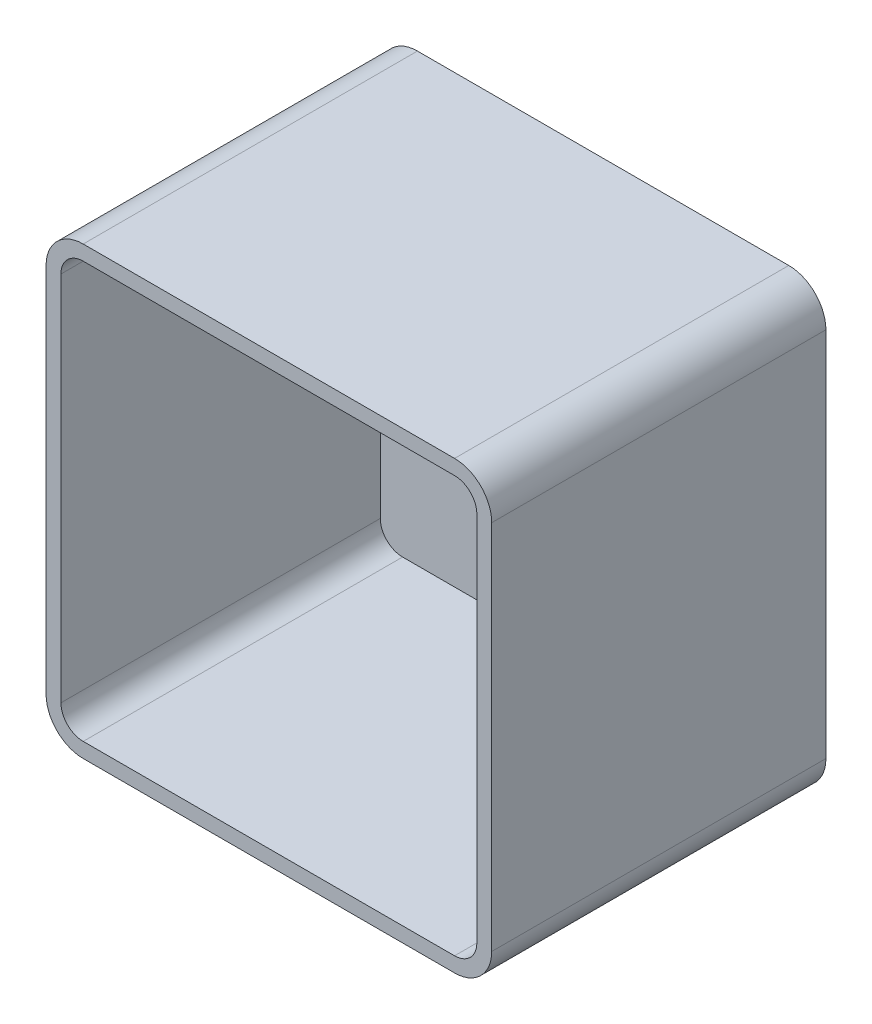
ISO-10303-21;
HEADER;
FILE_DESCRIPTION(('STEP AP214'),'2;1');
FILE_NAME('part.step','',(''),(''),'','','');
FILE_SCHEMA(('AUTOMOTIVE_DESIGN { 1 0 10303 214 1 1 1 1 }'));
ENDSEC;
DATA;
#1=APPLICATION_CONTEXT('core data for automotive mechanical design processes');
#2=APPLICATION_PROTOCOL_DEFINITION('international standard','automotive_design',2000,#1);
#3=PRODUCT_CONTEXT('',#1,'mechanical');
#4=PRODUCT('Part','Part','',(#3));
#5=PRODUCT_RELATED_PRODUCT_CATEGORY('part','',(#4));
#6=PRODUCT_DEFINITION_FORMATION('','',#4);
#7=PRODUCT_DEFINITION_CONTEXT('part definition',#1,'design');
#8=PRODUCT_DEFINITION('design','',#6,#7);
#9=PRODUCT_DEFINITION_SHAPE('','',#8);
#10=(LENGTH_UNIT() NAMED_UNIT(*) SI_UNIT(.MILLI.,.METRE.));
#11=(NAMED_UNIT(*) PLANE_ANGLE_UNIT() SI_UNIT($,.RADIAN.));
#12=(NAMED_UNIT(*) SI_UNIT($,.STERADIAN.) SOLID_ANGLE_UNIT());
#13=UNCERTAINTY_MEASURE_WITH_UNIT(LENGTH_MEASURE(1.E-05),#10,'distance_accuracy_value','');
#14=(GEOMETRIC_REPRESENTATION_CONTEXT(3) GLOBAL_UNCERTAINTY_ASSIGNED_CONTEXT((#13)) GLOBAL_UNIT_ASSIGNED_CONTEXT((#10,
#11,#12)) REPRESENTATION_CONTEXT('',''));
#15=CARTESIAN_POINT('',(0.,0.,0.));
#16=DIRECTION('',(0.,0.,1.));
#17=DIRECTION('',(1.,0.,0.));
#18=AXIS2_PLACEMENT_3D('',#15,#16,#17);
#19=CARTESIAN_POINT('',(0.,0.,90.));
#20=DIRECTION('',(1.,0.,0.));
#21=DIRECTION('',(0.,1.,0.));
#22=AXIS2_PLACEMENT_3D('',#19,#20,#21);
#23=PLANE('',#22);
#24=DIRECTION('',(0.,-1.,0.));
#25=VECTOR('',#24,1.);
#26=CARTESIAN_POINT('',(0.,0.,0.));
#27=LINE('',#26,#25);
#28=CARTESIAN_POINT('',(0.,110.,0.));
#29=VERTEX_POINT('',#28);
#30=CARTESIAN_POINT('',(0.,10.,0.));
#31=VERTEX_POINT('',#30);
#32=EDGE_CURVE('E220',#29,#31,#27,.T.);
#33=ORIENTED_EDGE('',*,*,#32,.T.);
#34=DIRECTION('',(0.,0.,-1.));
#35=VECTOR('',#34,1.);
#36=CARTESIAN_POINT('',(0.,10.,90.));
#37=LINE('',#36,#35);
#38=CARTESIAN_POINT('',(0.,10.,90.));
#39=VERTEX_POINT('',#38);
#40=EDGE_CURVE('E303',#31,#39,#37,.F.);
#41=ORIENTED_EDGE('',*,*,#40,.T.);
#42=DIRECTION('',(0.,-1.,0.));
#43=VECTOR('',#42,1.);
#44=CARTESIAN_POINT('',(0.,0.,90.));
#45=LINE('',#44,#43);
#46=CARTESIAN_POINT('',(0.,110.,90.));
#47=VERTEX_POINT('',#46);
#48=EDGE_CURVE('E251',#47,#39,#45,.T.);
#49=ORIENTED_EDGE('',*,*,#48,.F.);
#50=DIRECTION('',(0.,0.,-1.));
#51=VECTOR('',#50,1.);
#52=CARTESIAN_POINT('',(0.,110.,90.));
#53=LINE('',#52,#51);
#54=EDGE_CURVE('E299',#47,#29,#53,.T.);
#55=ORIENTED_EDGE('',*,*,#54,.T.);
#56=EDGE_LOOP('',(#33,#41,#49,#55));
#57=FACE_BOUND('',#56,.T.);
#58=ADVANCED_FACE('F39',(#57),#23,.F.);
#59=CARTESIAN_POINT('',(0.,0.,90.));
#60=DIRECTION('',(0.,1.,0.));
#61=DIRECTION('',(0.,0.,1.));
#62=AXIS2_PLACEMENT_3D('',#59,#60,#61);
#63=PLANE('',#62);
#64=DIRECTION('',(1.,0.,0.));
#65=VECTOR('',#64,1.);
#66=CARTESIAN_POINT('',(0.,0.,90.));
#67=LINE('',#66,#65);
#68=CARTESIAN_POINT('',(9.99999999999999,0.,90.));
#69=VERTEX_POINT('',#68);
#70=CARTESIAN_POINT('',(110.,0.,90.));
#71=VERTEX_POINT('',#70);
#72=EDGE_CURVE('E255',#69,#71,#67,.T.);
#73=ORIENTED_EDGE('',*,*,#72,.F.);
#74=DIRECTION('',(0.,0.,-1.));
#75=VECTOR('',#74,1.);
#76=CARTESIAN_POINT('',(9.99999999999999,0.,90.));
#77=LINE('',#76,#75);
#78=CARTESIAN_POINT('',(9.99999999999999,0.,0.));
#79=VERTEX_POINT('',#78);
#80=EDGE_CURVE('E283',#69,#79,#77,.T.);
#81=ORIENTED_EDGE('',*,*,#80,.T.);
#82=DIRECTION('',(1.,0.,0.));
#83=VECTOR('',#82,1.);
#84=CARTESIAN_POINT('',(0.,0.,0.));
#85=LINE('',#84,#83);
#86=CARTESIAN_POINT('',(110.,0.,0.));
#87=VERTEX_POINT('',#86);
#88=EDGE_CURVE('E271',#79,#87,#85,.T.);
#89=ORIENTED_EDGE('',*,*,#88,.T.);
#90=DIRECTION('',(0.,0.,-1.));
#91=VECTOR('',#90,1.);
#92=CARTESIAN_POINT('',(110.,0.,90.));
#93=LINE('',#92,#91);
#94=EDGE_CURVE('E267',#87,#71,#93,.F.);
#95=ORIENTED_EDGE('',*,*,#94,.T.);
#96=EDGE_LOOP('',(#73,#81,#89,#95));
#97=FACE_BOUND('',#96,.T.);
#98=ADVANCED_FACE('F355',(#97),#63,.F.);
#99=CARTESIAN_POINT('',(120.,0.,90.));
#100=DIRECTION('',(-1.,0.,0.));
#101=DIRECTION('',(0.,-1.,0.));
#102=AXIS2_PLACEMENT_3D('',#99,#100,#101);
#103=PLANE('',#102);
#104=DIRECTION('',(0.,1.,0.));
#105=VECTOR('',#104,1.);
#106=CARTESIAN_POINT('',(120.,0.,90.));
#107=LINE('',#106,#105);
#108=CARTESIAN_POINT('',(120.,10.,90.));
#109=VERTEX_POINT('',#108);
#110=CARTESIAN_POINT('',(120.,110.,90.));
#111=VERTEX_POINT('',#110);
#112=EDGE_CURVE('E260',#109,#111,#107,.T.);
#113=ORIENTED_EDGE('',*,*,#112,.F.);
#114=DIRECTION('',(0.,0.,-1.));
#115=VECTOR('',#114,1.);
#116=CARTESIAN_POINT('',(120.,10.,90.));
#117=LINE('',#116,#115);
#118=CARTESIAN_POINT('',(120.,10.,0.));
#119=VERTEX_POINT('',#118);
#120=EDGE_CURVE('E11',#109,#119,#117,.T.);
#121=ORIENTED_EDGE('',*,*,#120,.T.);
#122=DIRECTION('',(0.,1.,0.));
#123=VECTOR('',#122,1.);
#124=CARTESIAN_POINT('',(120.,0.,0.));
#125=LINE('',#124,#123);
#126=CARTESIAN_POINT('',(120.,110.,0.));
#127=VERTEX_POINT('',#126);
#128=EDGE_CURVE('E275',#119,#127,#125,.T.);
#129=ORIENTED_EDGE('',*,*,#128,.T.);
#130=DIRECTION('',(0.,0.,-1.));
#131=VECTOR('',#130,1.);
#132=CARTESIAN_POINT('',(120.,110.,90.));
#133=LINE('',#132,#131);
#134=EDGE_CURVE('E48',#127,#111,#133,.F.);
#135=ORIENTED_EDGE('',*,*,#134,.T.);
#136=EDGE_LOOP('',(#113,#121,#129,#135));
#137=FACE_BOUND('',#136,.T.);
#138=ADVANCED_FACE('F327',(#137),#103,.F.);
#139=CARTESIAN_POINT('',(0.,120.,90.));
#140=DIRECTION('',(0.,-1.,0.));
#141=DIRECTION('',(0.,0.,-1.));
#142=AXIS2_PLACEMENT_3D('',#139,#140,#141);
#143=PLANE('',#142);
#144=DIRECTION('',(-1.,0.,0.));
#145=VECTOR('',#144,1.);
#146=CARTESIAN_POINT('',(0.,120.,0.));
#147=LINE('',#146,#145);
#148=CARTESIAN_POINT('',(110.,120.,0.));
#149=VERTEX_POINT('',#148);
#150=CARTESIAN_POINT('',(9.99999999999997,120.,0.));
#151=VERTEX_POINT('',#150);
#152=EDGE_CURVE('E256',#149,#151,#147,.T.);
#153=ORIENTED_EDGE('',*,*,#152,.T.);
#154=DIRECTION('',(0.,0.,-1.));
#155=VECTOR('',#154,1.);
#156=CARTESIAN_POINT('',(9.99999999999997,120.,90.));
#157=LINE('',#156,#155);
#158=CARTESIAN_POINT('',(9.99999999999997,120.,90.));
#159=VERTEX_POINT('',#158);
#160=EDGE_CURVE('E63',#151,#159,#157,.F.);
#161=ORIENTED_EDGE('',*,*,#160,.T.);
#162=DIRECTION('',(-1.,0.,0.));
#163=VECTOR('',#162,1.);
#164=CARTESIAN_POINT('',(0.,120.,90.));
#165=LINE('',#164,#163);
#166=CARTESIAN_POINT('',(110.,120.,90.));
#167=VERTEX_POINT('',#166);
#168=EDGE_CURVE('E264',#167,#159,#165,.T.);
#169=ORIENTED_EDGE('',*,*,#168,.F.);
#170=DIRECTION('',(0.,0.,-1.));
#171=VECTOR('',#170,1.);
#172=CARTESIAN_POINT('',(110.,120.,90.));
#173=LINE('',#172,#171);
#174=EDGE_CURVE('E318',#167,#149,#173,.T.);
#175=ORIENTED_EDGE('',*,*,#174,.T.);
#176=EDGE_LOOP('',(#153,#161,#169,#175));
#177=FACE_BOUND('',#176,.T.);
#178=ADVANCED_FACE('F337',(#177),#143,.F.);
#179=CARTESIAN_POINT('',(0.,0.,90.));
#180=DIRECTION('',(0.,0.,-1.));
#181=DIRECTION('',(-1.,0.,0.));
#182=AXIS2_PLACEMENT_3D('',#179,#180,#181);
#183=PLANE('',#182);
#184=DIRECTION('',(0.,-1.,0.));
#185=VECTOR('',#184,1.);
#186=CARTESIAN_POINT('',(4.,0.,90.));
#187=LINE('',#186,#185);
#188=CARTESIAN_POINT('',(3.99999999999997,110.,90.));
#189=VERTEX_POINT('',#188);
#190=CARTESIAN_POINT('',(4.,10.,90.));
#191=VERTEX_POINT('',#190);
#192=EDGE_CURVE('E183',#189,#191,#187,.T.);
#193=ORIENTED_EDGE('',*,*,#192,.F.);
#194=CARTESIAN_POINT('',(9.99999999999997,110.,90.));
#195=DIRECTION('',(0.,0.,-1.));
#196=DIRECTION('',(-1.,0.,0.));
#197=AXIS2_PLACEMENT_3D('',#194,#195,#196);
#198=CIRCLE('',#197,6.);
#199=CARTESIAN_POINT('',(9.99999999999997,116.,90.));
#200=VERTEX_POINT('',#199);
#201=EDGE_CURVE('E237',#200,#189,#198,.F.);
#202=ORIENTED_EDGE('',*,*,#201,.F.);
#203=DIRECTION('',(-1.,0.,0.));
#204=VECTOR('',#203,1.);
#205=CARTESIAN_POINT('',(0.,116.,90.));
#206=LINE('',#205,#204);
#207=CARTESIAN_POINT('',(110.,116.,90.));
#208=VERTEX_POINT('',#207);
#209=EDGE_CURVE('E55',#208,#200,#206,.T.);
#210=ORIENTED_EDGE('',*,*,#209,.F.);
#211=CARTESIAN_POINT('',(110.,110.,90.));
#212=DIRECTION('',(0.,0.,-1.));
#213=DIRECTION('',(-1.,0.,0.));
#214=AXIS2_PLACEMENT_3D('',#211,#212,#213);
#215=CIRCLE('',#214,6.);
#216=CARTESIAN_POINT('',(116.,110.,90.));
#217=VERTEX_POINT('',#216);
#218=EDGE_CURVE('E186',#217,#208,#215,.F.);
#219=ORIENTED_EDGE('',*,*,#218,.F.);
#220=DIRECTION('',(0.,1.,0.));
#221=VECTOR('',#220,1.);
#222=CARTESIAN_POINT('',(116.,0.,90.));
#223=LINE('',#222,#221);
#224=CARTESIAN_POINT('',(116.,10.,90.));
#225=VERTEX_POINT('',#224);
#226=EDGE_CURVE('E241',#225,#217,#223,.T.);
#227=ORIENTED_EDGE('',*,*,#226,.F.);
#228=CARTESIAN_POINT('',(110.,10.,90.));
#229=DIRECTION('',(0.,0.,-1.));
#230=DIRECTION('',(-1.,0.,0.));
#231=AXIS2_PLACEMENT_3D('',#228,#229,#230);
#232=CIRCLE('',#231,6.);
#233=CARTESIAN_POINT('',(110.,4.,90.));
#234=VERTEX_POINT('',#233);
#235=EDGE_CURVE('E190',#234,#225,#232,.F.);
#236=ORIENTED_EDGE('',*,*,#235,.F.);
#237=DIRECTION('',(1.,0.,0.));
#238=VECTOR('',#237,1.);
#239=CARTESIAN_POINT('',(0.,4.,90.));
#240=LINE('',#239,#238);
#241=CARTESIAN_POINT('',(9.99999999999999,4.,90.));
#242=VERTEX_POINT('',#241);
#243=EDGE_CURVE('E234',#242,#234,#240,.T.);
#244=ORIENTED_EDGE('',*,*,#243,.F.);
#245=CARTESIAN_POINT('',(9.99999999999999,10.,90.));
#246=DIRECTION('',(0.,0.,-1.));
#247=DIRECTION('',(-1.,0.,0.));
#248=AXIS2_PLACEMENT_3D('',#245,#246,#247);
#249=CIRCLE('',#248,6.);
#250=EDGE_CURVE('E229',#191,#242,#249,.F.);
#251=ORIENTED_EDGE('',*,*,#250,.F.);
#252=EDGE_LOOP('',(#193,#202,#210,#219,#227,#236,#244,#251));
#253=FACE_BOUND('',#252,.T.);
#254=ORIENTED_EDGE('',*,*,#48,.T.);
#255=CARTESIAN_POINT('',(9.99999999999999,10.,90.));
#256=DIRECTION('',(0.,0.,-1.));
#257=DIRECTION('',(-1.,0.,0.));
#258=AXIS2_PLACEMENT_3D('',#255,#256,#257);
#259=CIRCLE('',#258,10.);
#260=EDGE_CURVE('E315',#39,#69,#259,.F.);
#261=ORIENTED_EDGE('',*,*,#260,.T.);
#262=ORIENTED_EDGE('',*,*,#72,.T.);
#263=CARTESIAN_POINT('',(110.,10.,90.));
#264=DIRECTION('',(0.,0.,-1.));
#265=DIRECTION('',(-1.,0.,0.));
#266=AXIS2_PLACEMENT_3D('',#263,#264,#265);
#267=CIRCLE('',#266,10.);
#268=EDGE_CURVE('E309',#71,#109,#267,.F.);
#269=ORIENTED_EDGE('',*,*,#268,.T.);
#270=ORIENTED_EDGE('',*,*,#112,.T.);
#271=CARTESIAN_POINT('',(110.,110.,90.));
#272=DIRECTION('',(0.,0.,-1.));
#273=DIRECTION('',(-1.,0.,0.));
#274=AXIS2_PLACEMENT_3D('',#271,#272,#273);
#275=CIRCLE('',#274,10.);
#276=EDGE_CURVE('E306',#111,#167,#275,.F.);
#277=ORIENTED_EDGE('',*,*,#276,.T.);
#278=ORIENTED_EDGE('',*,*,#168,.T.);
#279=CARTESIAN_POINT('',(9.99999999999997,110.,90.));
#280=DIRECTION('',(0.,0.,-1.));
#281=DIRECTION('',(-1.,0.,0.));
#282=AXIS2_PLACEMENT_3D('',#279,#280,#281);
#283=CIRCLE('',#282,10.);
#284=EDGE_CURVE('E312',#159,#47,#283,.F.);
#285=ORIENTED_EDGE('',*,*,#284,.T.);
#286=EDGE_LOOP('',(#254,#261,#262,#269,#270,#277,#278,#285));
#287=FACE_BOUND('',#286,.T.);
#288=ADVANCED_FACE('F333',(#253,#287),#183,.F.);
#289=CARTESIAN_POINT('',(0.,0.,0.));
#290=DIRECTION('',(0.,0.,-1.));
#291=DIRECTION('',(-1.,0.,0.));
#292=AXIS2_PLACEMENT_3D('',#289,#290,#291);
#293=PLANE('',#292);
#294=ORIENTED_EDGE('',*,*,#88,.F.);
#295=CARTESIAN_POINT('',(9.99999999999999,10.,0.));
#296=DIRECTION('',(0.,0.,-1.));
#297=DIRECTION('',(-1.,0.,0.));
#298=AXIS2_PLACEMENT_3D('',#295,#296,#297);
#299=CIRCLE('',#298,10.);
#300=EDGE_CURVE('E296',#79,#31,#299,.T.);
#301=ORIENTED_EDGE('',*,*,#300,.T.);
#302=ORIENTED_EDGE('',*,*,#32,.F.);
#303=CARTESIAN_POINT('',(9.99999999999997,110.,0.));
#304=DIRECTION('',(0.,0.,-1.));
#305=DIRECTION('',(-1.,0.,0.));
#306=AXIS2_PLACEMENT_3D('',#303,#304,#305);
#307=CIRCLE('',#306,10.);
#308=EDGE_CURVE('E293',#29,#151,#307,.T.);
#309=ORIENTED_EDGE('',*,*,#308,.T.);
#310=ORIENTED_EDGE('',*,*,#152,.F.);
#311=CARTESIAN_POINT('',(110.,110.,0.));
#312=DIRECTION('',(0.,0.,-1.));
#313=DIRECTION('',(-1.,0.,0.));
#314=AXIS2_PLACEMENT_3D('',#311,#312,#313);
#315=CIRCLE('',#314,10.);
#316=EDGE_CURVE('E287',#149,#127,#315,.T.);
#317=ORIENTED_EDGE('',*,*,#316,.T.);
#318=ORIENTED_EDGE('',*,*,#128,.F.);
#319=CARTESIAN_POINT('',(110.,10.,0.));
#320=DIRECTION('',(0.,0.,-1.));
#321=DIRECTION('',(-1.,0.,0.));
#322=AXIS2_PLACEMENT_3D('',#319,#320,#321);
#323=CIRCLE('',#322,10.);
#324=EDGE_CURVE('E290',#119,#87,#323,.T.);
#325=ORIENTED_EDGE('',*,*,#324,.T.);
#326=EDGE_LOOP('',(#294,#301,#302,#309,#310,#317,#318,#325));
#327=FACE_BOUND('',#326,.T.);
#328=ADVANCED_FACE('F340',(#327),#293,.T.);
#329=CARTESIAN_POINT('',(9.99999999999999,10.,90.));
#330=DIRECTION('',(0.,0.,-1.));
#331=DIRECTION('',(-1.,0.,0.));
#332=AXIS2_PLACEMENT_3D('',#329,#330,#331);
#333=CYLINDRICAL_SURFACE('',#332,10.);
#334=ORIENTED_EDGE('',*,*,#260,.F.);
#335=ORIENTED_EDGE('',*,*,#40,.F.);
#336=ORIENTED_EDGE('',*,*,#300,.F.);
#337=ORIENTED_EDGE('',*,*,#80,.F.);
#338=EDGE_LOOP('',(#334,#335,#336,#337));
#339=FACE_BOUND('',#338,.T.);
#340=ADVANCED_FACE('F353',(#339),#333,.T.);
#341=CARTESIAN_POINT('',(9.99999999999997,110.,90.));
#342=DIRECTION('',(0.,0.,-1.));
#343=DIRECTION('',(-1.,0.,0.));
#344=AXIS2_PLACEMENT_3D('',#341,#342,#343);
#345=CYLINDRICAL_SURFACE('',#344,10.);
#346=ORIENTED_EDGE('',*,*,#284,.F.);
#347=ORIENTED_EDGE('',*,*,#160,.F.);
#348=ORIENTED_EDGE('',*,*,#308,.F.);
#349=ORIENTED_EDGE('',*,*,#54,.F.);
#350=EDGE_LOOP('',(#346,#347,#348,#349));
#351=FACE_BOUND('',#350,.T.);
#352=ADVANCED_FACE('F345',(#351),#345,.T.);
#353=CARTESIAN_POINT('',(110.,10.,90.));
#354=DIRECTION('',(0.,0.,-1.));
#355=DIRECTION('',(-1.,0.,0.));
#356=AXIS2_PLACEMENT_3D('',#353,#354,#355);
#357=CYLINDRICAL_SURFACE('',#356,10.);
#358=ORIENTED_EDGE('',*,*,#268,.F.);
#359=ORIENTED_EDGE('',*,*,#94,.F.);
#360=ORIENTED_EDGE('',*,*,#324,.F.);
#361=ORIENTED_EDGE('',*,*,#120,.F.);
#362=EDGE_LOOP('',(#358,#359,#360,#361));
#363=FACE_BOUND('',#362,.T.);
#364=ADVANCED_FACE('F358',(#363),#357,.T.);
#365=CARTESIAN_POINT('',(110.,110.,90.));
#366=DIRECTION('',(0.,0.,-1.));
#367=DIRECTION('',(-1.,0.,0.));
#368=AXIS2_PLACEMENT_3D('',#365,#366,#367);
#369=CYLINDRICAL_SURFACE('',#368,10.);
#370=ORIENTED_EDGE('',*,*,#276,.F.);
#371=ORIENTED_EDGE('',*,*,#134,.F.);
#372=ORIENTED_EDGE('',*,*,#316,.F.);
#373=ORIENTED_EDGE('',*,*,#174,.F.);
#374=EDGE_LOOP('',(#370,#371,#372,#373));
#375=FACE_BOUND('',#374,.T.);
#376=ADVANCED_FACE('F41',(#375),#369,.T.);
#377=CARTESIAN_POINT('',(4.,0.,90.));
#378=DIRECTION('',(1.,0.,0.));
#379=DIRECTION('',(0.,1.,0.));
#380=AXIS2_PLACEMENT_3D('',#377,#378,#379);
#381=PLANE('',#380);
#382=DIRECTION('',(0.,-1.,0.));
#383=VECTOR('',#382,1.);
#384=CARTESIAN_POINT('',(4.,0.,4.));
#385=LINE('',#384,#383);
#386=CARTESIAN_POINT('',(3.99999999999997,110.,4.));
#387=VERTEX_POINT('',#386);
#388=CARTESIAN_POINT('',(4.,10.,4.));
#389=VERTEX_POINT('',#388);
#390=EDGE_CURVE('E172',#387,#389,#385,.T.);
#391=ORIENTED_EDGE('',*,*,#390,.F.);
#392=DIRECTION('',(0.,0.,1.));
#393=VECTOR('',#392,1.);
#394=CARTESIAN_POINT('',(3.99999999999997,110.,90.));
#395=LINE('',#394,#393);
#396=EDGE_CURVE('E168',#189,#387,#395,.F.);
#397=ORIENTED_EDGE('',*,*,#396,.F.);
#398=ORIENTED_EDGE('',*,*,#192,.T.);
#399=DIRECTION('',(0.,0.,1.));
#400=VECTOR('',#399,1.);
#401=CARTESIAN_POINT('',(4.,10.,90.));
#402=LINE('',#401,#400);
#403=EDGE_CURVE('E160',#389,#191,#402,.T.);
#404=ORIENTED_EDGE('',*,*,#403,.F.);
#405=EDGE_LOOP('',(#391,#397,#398,#404));
#406=FACE_BOUND('',#405,.T.);
#407=ADVANCED_FACE('F181',(#406),#381,.T.);
#408=CARTESIAN_POINT('',(0.,4.,90.));
#409=DIRECTION('',(0.,1.,0.));
#410=DIRECTION('',(0.,0.,1.));
#411=AXIS2_PLACEMENT_3D('',#408,#409,#410);
#412=PLANE('',#411);
#413=ORIENTED_EDGE('',*,*,#243,.T.);
#414=DIRECTION('',(0.,0.,1.));
#415=VECTOR('',#414,1.);
#416=CARTESIAN_POINT('',(110.,4.,90.));
#417=LINE('',#416,#415);
#418=CARTESIAN_POINT('',(110.,4.,4.));
#419=VERTEX_POINT('',#418);
#420=EDGE_CURVE('E213',#419,#234,#417,.T.);
#421=ORIENTED_EDGE('',*,*,#420,.F.);
#422=DIRECTION('',(1.,0.,0.));
#423=VECTOR('',#422,1.);
#424=CARTESIAN_POINT('',(0.,4.,4.));
#425=LINE('',#424,#423);
#426=CARTESIAN_POINT('',(9.99999999999999,4.,4.));
#427=VERTEX_POINT('',#426);
#428=EDGE_CURVE('E179',#427,#419,#425,.T.);
#429=ORIENTED_EDGE('',*,*,#428,.F.);
#430=DIRECTION('',(0.,0.,1.));
#431=VECTOR('',#430,1.);
#432=CARTESIAN_POINT('',(9.99999999999999,4.,90.));
#433=LINE('',#432,#431);
#434=EDGE_CURVE('E163',#242,#427,#433,.F.);
#435=ORIENTED_EDGE('',*,*,#434,.F.);
#436=EDGE_LOOP('',(#413,#421,#429,#435));
#437=FACE_BOUND('',#436,.T.);
#438=ADVANCED_FACE('F412',(#437),#412,.T.);
#439=CARTESIAN_POINT('',(116.,0.,90.));
#440=DIRECTION('',(-1.,0.,0.));
#441=DIRECTION('',(0.,-1.,0.));
#442=AXIS2_PLACEMENT_3D('',#439,#440,#441);
#443=PLANE('',#442);
#444=ORIENTED_EDGE('',*,*,#226,.T.);
#445=DIRECTION('',(0.,0.,1.));
#446=VECTOR('',#445,1.);
#447=CARTESIAN_POINT('',(116.,110.,90.));
#448=LINE('',#447,#446);
#449=CARTESIAN_POINT('',(116.,110.,4.));
#450=VERTEX_POINT('',#449);
#451=EDGE_CURVE('E221',#450,#217,#448,.T.);
#452=ORIENTED_EDGE('',*,*,#451,.F.);
#453=DIRECTION('',(0.,1.,0.));
#454=VECTOR('',#453,1.);
#455=CARTESIAN_POINT('',(116.,0.,4.));
#456=LINE('',#455,#454);
#457=CARTESIAN_POINT('',(116.,10.,4.));
#458=VERTEX_POINT('',#457);
#459=EDGE_CURVE('E195',#458,#450,#456,.T.);
#460=ORIENTED_EDGE('',*,*,#459,.F.);
#461=DIRECTION('',(0.,0.,1.));
#462=VECTOR('',#461,1.);
#463=CARTESIAN_POINT('',(116.,10.,90.));
#464=LINE('',#463,#462);
#465=EDGE_CURVE('E216',#225,#458,#464,.F.);
#466=ORIENTED_EDGE('',*,*,#465,.F.);
#467=EDGE_LOOP('',(#444,#452,#460,#466));
#468=FACE_BOUND('',#467,.T.);
#469=ADVANCED_FACE('F421',(#468),#443,.T.);
#470=CARTESIAN_POINT('',(0.,116.,90.));
#471=DIRECTION('',(0.,-1.,0.));
#472=DIRECTION('',(0.,0.,-1.));
#473=AXIS2_PLACEMENT_3D('',#470,#471,#472);
#474=PLANE('',#473);
#475=DIRECTION('',(-1.,0.,0.));
#476=VECTOR('',#475,1.);
#477=CARTESIAN_POINT('',(0.,116.,4.));
#478=LINE('',#477,#476);
#479=CARTESIAN_POINT('',(110.,116.,4.));
#480=VERTEX_POINT('',#479);
#481=CARTESIAN_POINT('',(9.99999999999997,116.,4.));
#482=VERTEX_POINT('',#481);
#483=EDGE_CURVE('E200',#480,#482,#478,.T.);
#484=ORIENTED_EDGE('',*,*,#483,.F.);
#485=DIRECTION('',(0.,0.,-1.));
#486=VECTOR('',#485,1.);
#487=CARTESIAN_POINT('',(110.,116.,90.));
#488=LINE('',#487,#486);
#489=EDGE_CURVE('E225',#208,#480,#488,.T.);
#490=ORIENTED_EDGE('',*,*,#489,.F.);
#491=ORIENTED_EDGE('',*,*,#209,.T.);
#492=DIRECTION('',(0.,0.,-1.));
#493=VECTOR('',#492,1.);
#494=CARTESIAN_POINT('',(9.99999999999997,116.,90.));
#495=LINE('',#494,#493);
#496=EDGE_CURVE('E224',#482,#200,#495,.F.);
#497=ORIENTED_EDGE('',*,*,#496,.F.);
#498=EDGE_LOOP('',(#484,#490,#491,#497));
#499=FACE_BOUND('',#498,.T.);
#500=ADVANCED_FACE('F431',(#499),#474,.T.);
#501=CARTESIAN_POINT('',(0.,0.,4.));
#502=DIRECTION('',(0.,0.,-1.));
#503=DIRECTION('',(-1.,0.,0.));
#504=AXIS2_PLACEMENT_3D('',#501,#502,#503);
#505=PLANE('',#504);
#506=ORIENTED_EDGE('',*,*,#428,.T.);
#507=CARTESIAN_POINT('',(110.,10.,4.));
#508=DIRECTION('',(0.,0.,-1.));
#509=DIRECTION('',(-1.,0.,0.));
#510=AXIS2_PLACEMENT_3D('',#507,#508,#509);
#511=CIRCLE('',#510,6.);
#512=EDGE_CURVE('E199',#458,#419,#511,.T.);
#513=ORIENTED_EDGE('',*,*,#512,.F.);
#514=ORIENTED_EDGE('',*,*,#459,.T.);
#515=CARTESIAN_POINT('',(110.,110.,4.));
#516=DIRECTION('',(0.,0.,-1.));
#517=DIRECTION('',(-1.,0.,0.));
#518=AXIS2_PLACEMENT_3D('',#515,#516,#517);
#519=CIRCLE('',#518,6.);
#520=EDGE_CURVE('E203',#480,#450,#519,.T.);
#521=ORIENTED_EDGE('',*,*,#520,.F.);
#522=ORIENTED_EDGE('',*,*,#483,.T.);
#523=CARTESIAN_POINT('',(9.99999999999997,110.,4.));
#524=DIRECTION('',(0.,0.,-1.));
#525=DIRECTION('',(-1.,0.,0.));
#526=AXIS2_PLACEMENT_3D('',#523,#524,#525);
#527=CIRCLE('',#526,6.);
#528=EDGE_CURVE('E169',#387,#482,#527,.T.);
#529=ORIENTED_EDGE('',*,*,#528,.F.);
#530=ORIENTED_EDGE('',*,*,#390,.T.);
#531=CARTESIAN_POINT('',(9.99999999999999,10.,4.));
#532=DIRECTION('',(0.,0.,-1.));
#533=DIRECTION('',(-1.,0.,0.));
#534=AXIS2_PLACEMENT_3D('',#531,#532,#533);
#535=CIRCLE('',#534,6.);
#536=EDGE_CURVE('E156',#427,#389,#535,.T.);
#537=ORIENTED_EDGE('',*,*,#536,.F.);
#538=EDGE_LOOP('',(#506,#513,#514,#521,#522,#529,#530,#537));
#539=FACE_BOUND('',#538,.T.);
#540=ADVANCED_FACE('F173',(#539),#505,.F.);
#541=CARTESIAN_POINT('',(9.99999999999999,10.,90.));
#542=DIRECTION('',(0.,0.,-1.));
#543=DIRECTION('',(-1.,0.,0.));
#544=AXIS2_PLACEMENT_3D('',#541,#542,#543);
#545=CYLINDRICAL_SURFACE('',#544,6.);
#546=ORIENTED_EDGE('',*,*,#250,.T.);
#547=ORIENTED_EDGE('',*,*,#434,.T.);
#548=ORIENTED_EDGE('',*,*,#536,.T.);
#549=ORIENTED_EDGE('',*,*,#403,.T.);
#550=EDGE_LOOP('',(#546,#547,#548,#549));
#551=FACE_BOUND('',#550,.T.);
#552=ADVANCED_FACE('F158',(#551),#545,.F.);
#553=CARTESIAN_POINT('',(9.99999999999997,110.,90.));
#554=DIRECTION('',(0.,0.,-1.));
#555=DIRECTION('',(-1.,0.,0.));
#556=AXIS2_PLACEMENT_3D('',#553,#554,#555);
#557=CYLINDRICAL_SURFACE('',#556,6.);
#558=ORIENTED_EDGE('',*,*,#201,.T.);
#559=ORIENTED_EDGE('',*,*,#396,.T.);
#560=ORIENTED_EDGE('',*,*,#528,.T.);
#561=ORIENTED_EDGE('',*,*,#496,.T.);
#562=EDGE_LOOP('',(#558,#559,#560,#561));
#563=FACE_BOUND('',#562,.T.);
#564=ADVANCED_FACE('F457',(#563),#557,.F.);
#565=CARTESIAN_POINT('',(110.,10.,90.));
#566=DIRECTION('',(0.,0.,-1.));
#567=DIRECTION('',(-1.,0.,0.));
#568=AXIS2_PLACEMENT_3D('',#565,#566,#567);
#569=CYLINDRICAL_SURFACE('',#568,6.);
#570=ORIENTED_EDGE('',*,*,#235,.T.);
#571=ORIENTED_EDGE('',*,*,#465,.T.);
#572=ORIENTED_EDGE('',*,*,#512,.T.);
#573=ORIENTED_EDGE('',*,*,#420,.T.);
#574=EDGE_LOOP('',(#570,#571,#572,#573));
#575=FACE_BOUND('',#574,.T.);
#576=ADVANCED_FACE('F466',(#575),#569,.F.);
#577=CARTESIAN_POINT('',(110.,110.,90.));
#578=DIRECTION('',(0.,0.,-1.));
#579=DIRECTION('',(-1.,0.,0.));
#580=AXIS2_PLACEMENT_3D('',#577,#578,#579);
#581=CYLINDRICAL_SURFACE('',#580,6.);
#582=ORIENTED_EDGE('',*,*,#218,.T.);
#583=ORIENTED_EDGE('',*,*,#489,.T.);
#584=ORIENTED_EDGE('',*,*,#520,.T.);
#585=ORIENTED_EDGE('',*,*,#451,.T.);
#586=EDGE_LOOP('',(#582,#583,#584,#585));
#587=FACE_BOUND('',#586,.T.);
#588=ADVANCED_FACE('F476',(#587),#581,.F.);
#589=CLOSED_SHELL('',(#58,#98,#138,#178,#288,#328,#340,#352,#364,#376,#407,#438,#469,#500,#540,
#552,#564,#576,#588));
#590=MANIFOLD_SOLID_BREP('B2',#589);
#591=ADVANCED_BREP_SHAPE_REPRESENTATION('',(#18,#590),#14);
#592=SHAPE_DEFINITION_REPRESENTATION(#9,#591);
ENDSEC;
END-ISO-10303-21;
